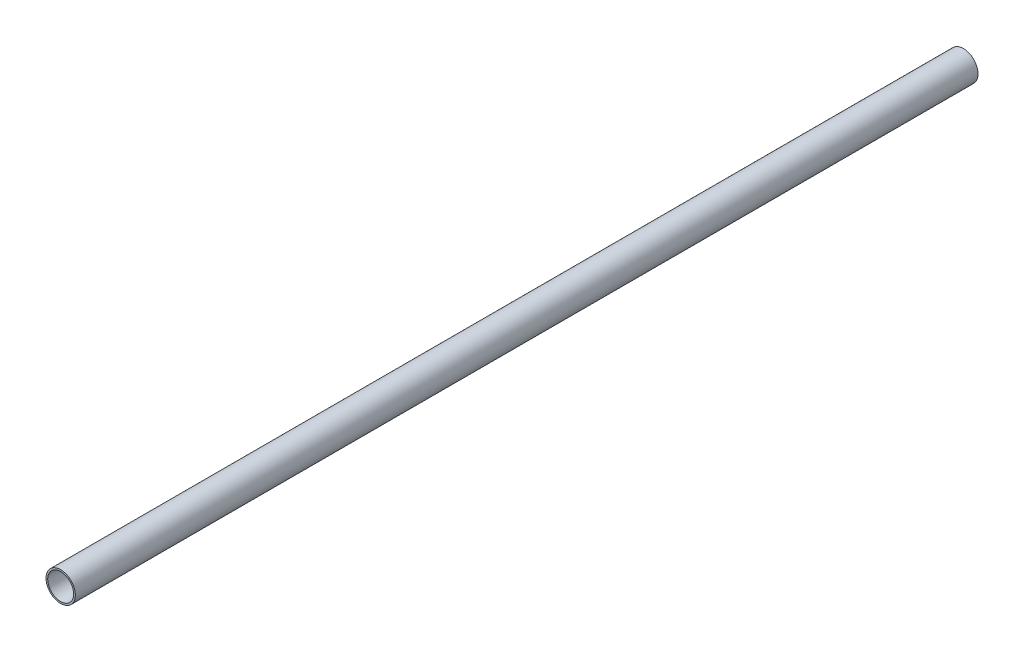
ISO-10303-21;
HEADER;
FILE_DESCRIPTION(('STEP AP214'),'2;1');
FILE_NAME('part.step','',(''),(''),'','','');
FILE_SCHEMA(('AUTOMOTIVE_DESIGN { 1 0 10303 214 1 1 1 1 }'));
ENDSEC;
DATA;
#1=APPLICATION_CONTEXT('core data for automotive mechanical design processes');
#2=APPLICATION_PROTOCOL_DEFINITION('international standard','automotive_design',2000,#1);
#3=PRODUCT_CONTEXT('',#1,'mechanical');
#4=PRODUCT('Part','Part','',(#3));
#5=PRODUCT_RELATED_PRODUCT_CATEGORY('part','',(#4));
#6=PRODUCT_DEFINITION_FORMATION('','',#4);
#7=PRODUCT_DEFINITION_CONTEXT('part definition',#1,'design');
#8=PRODUCT_DEFINITION('design','',#6,#7);
#9=PRODUCT_DEFINITION_SHAPE('','',#8);
#10=(LENGTH_UNIT() NAMED_UNIT(*) SI_UNIT(.MILLI.,.METRE.));
#11=(NAMED_UNIT(*) PLANE_ANGLE_UNIT() SI_UNIT($,.RADIAN.));
#12=(NAMED_UNIT(*) SI_UNIT($,.STERADIAN.) SOLID_ANGLE_UNIT());
#13=UNCERTAINTY_MEASURE_WITH_UNIT(LENGTH_MEASURE(1.E-05),#10,'distance_accuracy_value','');
#14=(GEOMETRIC_REPRESENTATION_CONTEXT(3) GLOBAL_UNCERTAINTY_ASSIGNED_CONTEXT((#13)) GLOBAL_UNIT_ASSIGNED_CONTEXT((#10,
#11,#12)) REPRESENTATION_CONTEXT('',''));
#15=CARTESIAN_POINT('',(0.,0.,0.));
#16=DIRECTION('',(0.,0.,1.));
#17=DIRECTION('',(1.,0.,0.));
#18=AXIS2_PLACEMENT_3D('',#15,#16,#17);
#19=CARTESIAN_POINT('',(0.,0.,200.025));
#20=DIRECTION('',(0.,0.,1.));
#21=DIRECTION('',(1.,0.,0.));
#22=AXIS2_PLACEMENT_3D('',#19,#20,#21);
#23=PLANE('',#22);
#24=CARTESIAN_POINT('',(0.,0.,200.025));
#25=DIRECTION('',(0.,0.,1.));
#26=DIRECTION('',(1.,0.,0.));
#27=AXIS2_PLACEMENT_3D('',#24,#25,#26);
#28=CIRCLE('',#27,6.5);
#29=CARTESIAN_POINT('',(-6.5,0.,200.025));
#30=VERTEX_POINT('',#29);
#31=EDGE_CURVE('E10',#30,#30,#28,.T.);
#32=ORIENTED_EDGE('',*,*,#31,.T.);
#33=EDGE_LOOP('',(#32));
#34=FACE_BOUND('',#33,.T.);
#35=CARTESIAN_POINT('',(0.,0.,200.025));
#36=DIRECTION('',(0.,0.,1.));
#37=DIRECTION('',(1.,0.,0.));
#38=AXIS2_PLACEMENT_3D('',#35,#36,#37);
#39=CIRCLE('',#38,5.75000000000001);
#40=CARTESIAN_POINT('',(-5.75000000000001,0.,200.025));
#41=VERTEX_POINT('',#40);
#42=EDGE_CURVE('E50',#41,#41,#39,.T.);
#43=ORIENTED_EDGE('',*,*,#42,.F.);
#44=EDGE_LOOP('',(#43));
#45=FACE_BOUND('',#44,.T.);
#46=ADVANCED_FACE('F37',(#34,#45),#23,.T.);
#47=CARTESIAN_POINT('',(0.,0.,-200.025));
#48=DIRECTION('',(0.,0.,1.));
#49=DIRECTION('',(1.,0.,0.));
#50=AXIS2_PLACEMENT_3D('',#47,#48,#49);
#51=PLANE('',#50);
#52=CARTESIAN_POINT('',(0.,0.,-200.025));
#53=DIRECTION('',(0.,0.,1.));
#54=DIRECTION('',(1.,0.,0.));
#55=AXIS2_PLACEMENT_3D('',#52,#53,#54);
#56=CIRCLE('',#55,6.5);
#57=CARTESIAN_POINT('',(-6.5,0.,-200.025));
#58=VERTEX_POINT('',#57);
#59=EDGE_CURVE('E41',#58,#58,#56,.T.);
#60=ORIENTED_EDGE('',*,*,#59,.F.);
#61=EDGE_LOOP('',(#60));
#62=FACE_BOUND('',#61,.T.);
#63=CARTESIAN_POINT('',(0.,0.,-200.025));
#64=DIRECTION('',(0.,0.,1.));
#65=DIRECTION('',(1.,0.,0.));
#66=AXIS2_PLACEMENT_3D('',#63,#64,#65);
#67=CIRCLE('',#66,5.75000000000001);
#68=CARTESIAN_POINT('',(-5.75000000000001,0.,-200.025));
#69=VERTEX_POINT('',#68);
#70=EDGE_CURVE('E52',#69,#69,#67,.T.);
#71=ORIENTED_EDGE('',*,*,#70,.T.);
#72=EDGE_LOOP('',(#71));
#73=FACE_BOUND('',#72,.T.);
#74=ADVANCED_FACE('F64',(#62,#73),#51,.F.);
#75=CARTESIAN_POINT('',(0.,0.,200.025));
#76=DIRECTION('',(0.,0.,-1.));
#77=DIRECTION('',(-1.,0.,0.));
#78=AXIS2_PLACEMENT_3D('',#75,#76,#77);
#79=CYLINDRICAL_SURFACE('',#78,6.5);
#80=CARTESIAN_POINT('',(-6.5,0.,200.025));
#81=CARTESIAN_POINT('',(-6.5,0.,195.8578125));
#82=CARTESIAN_POINT('',(-6.5,0.,191.690625));
#83=CARTESIAN_POINT('',(-6.5,0.,183.35625));
#84=CARTESIAN_POINT('',(-6.5,0.,179.1890625));
#85=CARTESIAN_POINT('',(-6.5,0.,170.8546875));
#86=CARTESIAN_POINT('',(-6.5,0.,166.6875));
#87=CARTESIAN_POINT('',(-6.5,0.,158.353125));
#88=CARTESIAN_POINT('',(-6.5,0.,154.1859375));
#89=CARTESIAN_POINT('',(-6.5,0.,145.8515625));
#90=CARTESIAN_POINT('',(-6.5,0.,141.684375));
#91=CARTESIAN_POINT('',(-6.5,0.,133.35));
#92=CARTESIAN_POINT('',(-6.5,0.,129.1828125));
#93=CARTESIAN_POINT('',(-6.5,0.,120.8484375));
#94=CARTESIAN_POINT('',(-6.5,0.,116.68125));
#95=CARTESIAN_POINT('',(-6.5,0.,108.346875));
#96=CARTESIAN_POINT('',(-6.5,0.,104.1796875));
#97=CARTESIAN_POINT('',(-6.5,0.,95.8453125));
#98=CARTESIAN_POINT('',(-6.5,0.,91.678125));
#99=CARTESIAN_POINT('',(-6.5,0.,83.34375));
#100=CARTESIAN_POINT('',(-6.5,0.,79.1765625));
#101=CARTESIAN_POINT('',(-6.5,0.,70.8421875));
#102=CARTESIAN_POINT('',(-6.5,0.,66.675));
#103=CARTESIAN_POINT('',(-6.5,0.,58.340625));
#104=CARTESIAN_POINT('',(-6.5,0.,54.1734375));
#105=CARTESIAN_POINT('',(-6.5,0.,45.8390625));
#106=CARTESIAN_POINT('',(-6.5,0.,41.671875));
#107=CARTESIAN_POINT('',(-6.5,0.,33.3375));
#108=CARTESIAN_POINT('',(-6.5,0.,29.1703125));
#109=CARTESIAN_POINT('',(-6.5,0.,20.8359375));
#110=CARTESIAN_POINT('',(-6.5,0.,16.66875));
#111=CARTESIAN_POINT('',(-6.5,0.,8.33437499999998));
#112=CARTESIAN_POINT('',(-6.5,0.,4.16718749999997));
#113=CARTESIAN_POINT('',(-6.5,0.,-4.16718750000003));
#114=CARTESIAN_POINT('',(-6.5,0.,-8.33437500000003));
#115=CARTESIAN_POINT('',(-6.5,0.,-16.66875));
#116=CARTESIAN_POINT('',(-6.5,0.,-20.8359375));
#117=CARTESIAN_POINT('',(-6.5,0.,-29.1703125));
#118=CARTESIAN_POINT('',(-6.5,0.,-33.3375));
#119=CARTESIAN_POINT('',(-6.5,0.,-41.671875));
#120=CARTESIAN_POINT('',(-6.5,0.,-45.8390625));
#121=CARTESIAN_POINT('',(-6.5,0.,-54.1734375));
#122=CARTESIAN_POINT('',(-6.5,0.,-58.340625));
#123=CARTESIAN_POINT('',(-6.5,0.,-66.675));
#124=CARTESIAN_POINT('',(-6.5,0.,-70.8421875));
#125=CARTESIAN_POINT('',(-6.5,0.,-79.1765625));
#126=CARTESIAN_POINT('',(-6.5,0.,-83.34375));
#127=CARTESIAN_POINT('',(-6.5,0.,-91.678125));
#128=CARTESIAN_POINT('',(-6.5,0.,-95.8453125));
#129=CARTESIAN_POINT('',(-6.5,0.,-104.1796875));
#130=CARTESIAN_POINT('',(-6.5,0.,-108.346875));
#131=CARTESIAN_POINT('',(-6.5,0.,-116.68125));
#132=CARTESIAN_POINT('',(-6.5,0.,-120.8484375));
#133=CARTESIAN_POINT('',(-6.5,0.,-129.1828125));
#134=CARTESIAN_POINT('',(-6.5,0.,-133.35));
#135=CARTESIAN_POINT('',(-6.5,0.,-141.684375));
#136=CARTESIAN_POINT('',(-6.5,0.,-145.8515625));
#137=CARTESIAN_POINT('',(-6.5,0.,-154.1859375));
#138=CARTESIAN_POINT('',(-6.5,0.,-158.353125));
#139=CARTESIAN_POINT('',(-6.5,0.,-166.6875));
#140=CARTESIAN_POINT('',(-6.5,0.,-170.8546875));
#141=CARTESIAN_POINT('',(-6.5,0.,-179.1890625));
#142=CARTESIAN_POINT('',(-6.5,0.,-183.35625));
#143=CARTESIAN_POINT('',(-6.5,0.,-191.690625));
#144=CARTESIAN_POINT('',(-6.5,0.,-195.8578125));
#145=CARTESIAN_POINT('',(-6.5,0.,-200.025));
#146=B_SPLINE_CURVE_WITH_KNOTS('',3,(#80,#81,#82,#83,#84,#85,#86,#87,#88,#89,#90,#91,#92,#93,
#94,#95,#96,#97,#98,#99,#100,#101,#102,#103,#104,#105,#106,#107,#108,#109,#110,#111,#112,#113,
#114,#115,#116,#117,#118,#119,#120,#121,#122,#123,#124,#125,#126,#127,#128,#129,#130,#131,#132,
#133,#134,#135,#136,#137,#138,#139,#140,#141,#142,#143,#144,#145),.UNSPECIFIED.,.F.,.F.,(4,2,2,
2,2,2,2,2,2,2,2,2,2,2,2,2,2,2,2,2,2,2,2,2,2,2,2,2,2,2,2,2,4),(0.,12.5015625,25.003125,
37.5046875,50.00625,62.5078125,75.009375,87.5109375,100.0125,112.5140625,125.015625,137.5171875,
150.01875,162.5203125,175.021875,187.5234375,200.025,212.5265625,225.028125,237.5296875,
250.03125,262.5328125,275.034375,287.5359375,300.0375,312.5390625,325.040625,337.5421875,
350.04375,362.5453125,375.046875,387.5484375,400.05),.UNSPECIFIED.);
#147=EDGE_CURVE('BSEAM39',#30,#58,#146,.T.);
#148=ORIENTED_EDGE('',*,*,#31,.F.);
#149=ORIENTED_EDGE('',*,*,#59,.T.);
#150=ORIENTED_EDGE('',*,*,#147,.T.);
#151=ORIENTED_EDGE('',*,*,#147,.F.);
#152=EDGE_LOOP('',(#148,#150,#149,#151));
#153=FACE_BOUND('',#152,.T.);
#154=ADVANCED_FACE('F39',(#153),#79,.T.);
#155=CARTESIAN_POINT('',(0.,0.,200.025));
#156=DIRECTION('',(0.,0.,-1.));
#157=DIRECTION('',(-1.,0.,0.));
#158=AXIS2_PLACEMENT_3D('',#155,#156,#157);
#159=CYLINDRICAL_SURFACE('',#158,5.75000000000001);
#160=CARTESIAN_POINT('',(-5.75000000000001,0.,200.025));
#161=CARTESIAN_POINT('',(-5.75000000000001,0.,195.8578125));
#162=CARTESIAN_POINT('',(-5.75000000000001,0.,191.690625));
#163=CARTESIAN_POINT('',(-5.75000000000001,0.,183.35625));
#164=CARTESIAN_POINT('',(-5.75000000000001,0.,179.1890625));
#165=CARTESIAN_POINT('',(-5.75000000000001,0.,170.8546875));
#166=CARTESIAN_POINT('',(-5.75000000000001,0.,166.6875));
#167=CARTESIAN_POINT('',(-5.75000000000001,0.,158.353125));
#168=CARTESIAN_POINT('',(-5.75000000000001,0.,154.1859375));
#169=CARTESIAN_POINT('',(-5.75000000000001,0.,145.8515625));
#170=CARTESIAN_POINT('',(-5.75000000000001,0.,141.684375));
#171=CARTESIAN_POINT('',(-5.75000000000001,0.,133.35));
#172=CARTESIAN_POINT('',(-5.75000000000001,0.,129.1828125));
#173=CARTESIAN_POINT('',(-5.75000000000001,0.,120.8484375));
#174=CARTESIAN_POINT('',(-5.75000000000001,0.,116.68125));
#175=CARTESIAN_POINT('',(-5.75000000000001,0.,108.346875));
#176=CARTESIAN_POINT('',(-5.75000000000001,0.,104.1796875));
#177=CARTESIAN_POINT('',(-5.75000000000001,0.,95.8453125));
#178=CARTESIAN_POINT('',(-5.75000000000001,0.,91.678125));
#179=CARTESIAN_POINT('',(-5.75000000000001,0.,83.34375));
#180=CARTESIAN_POINT('',(-5.75000000000001,0.,79.1765625));
#181=CARTESIAN_POINT('',(-5.75000000000001,0.,70.8421875));
#182=CARTESIAN_POINT('',(-5.75000000000001,0.,66.675));
#183=CARTESIAN_POINT('',(-5.75000000000001,0.,58.340625));
#184=CARTESIAN_POINT('',(-5.75000000000001,0.,54.1734375));
#185=CARTESIAN_POINT('',(-5.75000000000001,0.,45.8390625));
#186=CARTESIAN_POINT('',(-5.75000000000001,0.,41.671875));
#187=CARTESIAN_POINT('',(-5.75000000000001,0.,33.3375));
#188=CARTESIAN_POINT('',(-5.75000000000001,0.,29.1703125));
#189=CARTESIAN_POINT('',(-5.75000000000001,0.,20.8359375));
#190=CARTESIAN_POINT('',(-5.75000000000001,0.,16.66875));
#191=CARTESIAN_POINT('',(-5.75000000000001,0.,8.33437499999998));
#192=CARTESIAN_POINT('',(-5.75000000000001,0.,4.16718749999997));
#193=CARTESIAN_POINT('',(-5.75000000000001,0.,-4.16718750000003));
#194=CARTESIAN_POINT('',(-5.75000000000001,0.,-8.33437500000003));
#195=CARTESIAN_POINT('',(-5.75000000000001,0.,-16.66875));
#196=CARTESIAN_POINT('',(-5.75000000000001,0.,-20.8359375));
#197=CARTESIAN_POINT('',(-5.75000000000001,0.,-29.1703125));
#198=CARTESIAN_POINT('',(-5.75000000000001,0.,-33.3375));
#199=CARTESIAN_POINT('',(-5.75000000000001,0.,-41.671875));
#200=CARTESIAN_POINT('',(-5.75000000000001,0.,-45.8390625));
#201=CARTESIAN_POINT('',(-5.75000000000001,0.,-54.1734375));
#202=CARTESIAN_POINT('',(-5.75000000000001,0.,-58.340625));
#203=CARTESIAN_POINT('',(-5.75000000000001,0.,-66.675));
#204=CARTESIAN_POINT('',(-5.75000000000001,0.,-70.8421875));
#205=CARTESIAN_POINT('',(-5.75000000000001,0.,-79.1765625));
#206=CARTESIAN_POINT('',(-5.75000000000001,0.,-83.34375));
#207=CARTESIAN_POINT('',(-5.75000000000001,0.,-91.678125));
#208=CARTESIAN_POINT('',(-5.75000000000001,0.,-95.8453125));
#209=CARTESIAN_POINT('',(-5.75000000000001,0.,-104.1796875));
#210=CARTESIAN_POINT('',(-5.75000000000001,0.,-108.346875));
#211=CARTESIAN_POINT('',(-5.75000000000001,0.,-116.68125));
#212=CARTESIAN_POINT('',(-5.75000000000001,0.,-120.8484375));
#213=CARTESIAN_POINT('',(-5.75000000000001,0.,-129.1828125));
#214=CARTESIAN_POINT('',(-5.75000000000001,0.,-133.35));
#215=CARTESIAN_POINT('',(-5.75000000000001,0.,-141.684375));
#216=CARTESIAN_POINT('',(-5.75000000000001,0.,-145.8515625));
#217=CARTESIAN_POINT('',(-5.75000000000001,0.,-154.1859375));
#218=CARTESIAN_POINT('',(-5.75000000000001,0.,-158.353125));
#219=CARTESIAN_POINT('',(-5.75000000000001,0.,-166.6875));
#220=CARTESIAN_POINT('',(-5.75000000000001,0.,-170.8546875));
#221=CARTESIAN_POINT('',(-5.75000000000001,0.,-179.1890625));
#222=CARTESIAN_POINT('',(-5.75000000000001,0.,-183.35625));
#223=CARTESIAN_POINT('',(-5.75000000000001,0.,-191.690625));
#224=CARTESIAN_POINT('',(-5.75000000000001,0.,-195.8578125));
#225=CARTESIAN_POINT('',(-5.75000000000001,0.,-200.025));
#226=B_SPLINE_CURVE_WITH_KNOTS('',3,(#160,#161,#162,#163,#164,#165,#166,#167,#168,#169,#170,
#171,#172,#173,#174,#175,#176,#177,#178,#179,#180,#181,#182,#183,#184,#185,#186,#187,#188,#189,
#190,#191,#192,#193,#194,#195,#196,#197,#198,#199,#200,#201,#202,#203,#204,#205,#206,#207,#208,
#209,#210,#211,#212,#213,#214,#215,#216,#217,#218,#219,#220,#221,#222,#223,#224,#225),
.UNSPECIFIED.,.F.,.F.,(4,2,2,2,2,2,2,2,2,2,2,2,2,2,2,2,2,2,2,2,2,2,2,2,2,2,2,2,2,2,2,2,4),(0.,
12.5015625,25.003125,37.5046875,50.00625,62.5078125,75.009375,87.5109375,100.0125,112.5140625,
125.015625,137.5171875,150.01875,162.5203125,175.021875,187.5234375,200.025,212.5265625,
225.028125,237.5296875,250.03125,262.5328125,275.034375,287.5359375,300.0375,312.5390625,
325.040625,337.5421875,350.04375,362.5453125,375.046875,387.5484375,400.05),.UNSPECIFIED.);
#227=EDGE_CURVE('BSEAM60',#41,#69,#226,.T.);
#228=ORIENTED_EDGE('',*,*,#42,.T.);
#229=ORIENTED_EDGE('',*,*,#70,.F.);
#230=ORIENTED_EDGE('',*,*,#227,.T.);
#231=ORIENTED_EDGE('',*,*,#227,.F.);
#232=EDGE_LOOP('',(#228,#230,#229,#231));
#233=FACE_BOUND('',#232,.T.);
#234=ADVANCED_FACE('F60',(#233),#159,.F.);
#235=CLOSED_SHELL('',(#46,#74,#154,#234));
#236=MANIFOLD_SOLID_BREP('B2',#235);
#237=ADVANCED_BREP_SHAPE_REPRESENTATION('',(#18,#236),#14);
#238=SHAPE_DEFINITION_REPRESENTATION(#9,#237);
ENDSEC;
END-ISO-10303-21;
